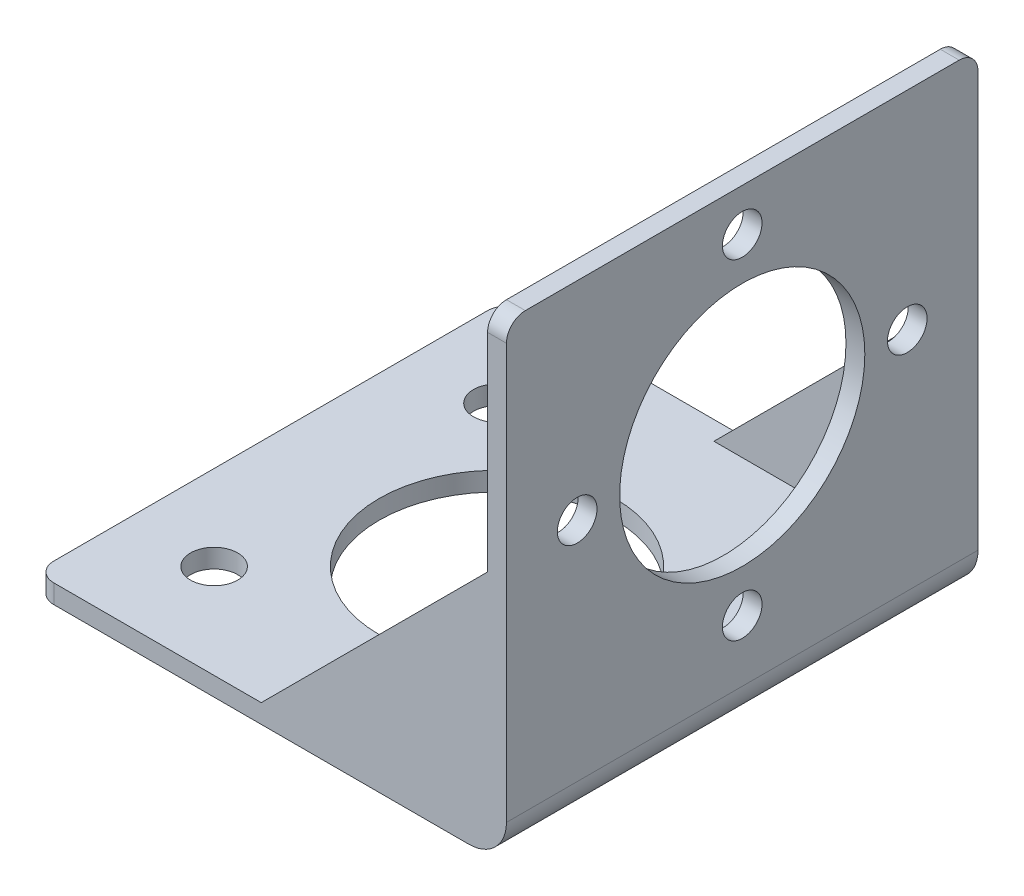
ISO-10303-21;
HEADER;
FILE_DESCRIPTION(('STEP AP214'),'2;1');
FILE_NAME('part.step','',(''),(''),'','','');
FILE_SCHEMA(('AUTOMOTIVE_DESIGN { 1 0 10303 214 1 1 1 1 }'));
ENDSEC;
DATA;
#1=APPLICATION_CONTEXT('core data for automotive mechanical design processes');
#2=APPLICATION_PROTOCOL_DEFINITION('international standard','automotive_design',2000,#1);
#3=PRODUCT_CONTEXT('',#1,'mechanical');
#4=PRODUCT('Part','Part','',(#3));
#5=PRODUCT_RELATED_PRODUCT_CATEGORY('part','',(#4));
#6=PRODUCT_DEFINITION_FORMATION('','',#4);
#7=PRODUCT_DEFINITION_CONTEXT('part definition',#1,'design');
#8=PRODUCT_DEFINITION('design','',#6,#7);
#9=PRODUCT_DEFINITION_SHAPE('','',#8);
#10=(LENGTH_UNIT() NAMED_UNIT(*) SI_UNIT(.MILLI.,.METRE.));
#11=(NAMED_UNIT(*) PLANE_ANGLE_UNIT() SI_UNIT($,.RADIAN.));
#12=(NAMED_UNIT(*) SI_UNIT($,.STERADIAN.) SOLID_ANGLE_UNIT());
#13=UNCERTAINTY_MEASURE_WITH_UNIT(LENGTH_MEASURE(1.E-05),#10,'distance_accuracy_value','');
#14=(GEOMETRIC_REPRESENTATION_CONTEXT(3) GLOBAL_UNCERTAINTY_ASSIGNED_CONTEXT((#13)) GLOBAL_UNIT_ASSIGNED_CONTEXT((#10,
#11,#12)) REPRESENTATION_CONTEXT('',''));
#15=CARTESIAN_POINT('',(0.,0.,0.));
#16=DIRECTION('',(0.,0.,1.));
#17=DIRECTION('',(1.,0.,0.));
#18=AXIS2_PLACEMENT_3D('',#15,#16,#17);
#19=CARTESIAN_POINT('',(46.,4.,50.));
#20=DIRECTION('',(0.,0.,-1.));
#21=DIRECTION('',(-1.,0.,0.));
#22=AXIS2_PLACEMENT_3D('',#19,#20,#21);
#23=CYLINDRICAL_SURFACE('',#22,2.);
#24=DIRECTION('',(0.,0.,-1.));
#25=VECTOR('',#24,1.);
#26=CARTESIAN_POINT('',(46.,2.,50.));
#27=LINE('',#26,#25);
#28=CARTESIAN_POINT('',(46.,2.,48.));
#29=VERTEX_POINT('',#28);
#30=CARTESIAN_POINT('',(46.,2.,2.));
#31=VERTEX_POINT('',#30);
#32=EDGE_CURVE('E244',#29,#31,#27,.T.);
#33=ORIENTED_EDGE('',*,*,#32,.F.);
#34=CARTESIAN_POINT('',(46.,4.,48.));
#35=DIRECTION('',(0.,0.,-1.));
#36=DIRECTION('',(-1.,0.,0.));
#37=AXIS2_PLACEMENT_3D('',#34,#35,#36);
#38=CIRCLE('',#37,2.);
#39=CARTESIAN_POINT('',(48.,4.,48.));
#40=VERTEX_POINT('',#39);
#41=EDGE_CURVE('E167',#29,#40,#38,.F.);
#42=ORIENTED_EDGE('',*,*,#41,.T.);
#43=DIRECTION('',(0.,0.,-1.));
#44=VECTOR('',#43,1.);
#45=CARTESIAN_POINT('',(48.,4.,50.));
#46=LINE('',#45,#44);
#47=CARTESIAN_POINT('',(48.,4.,2.));
#48=VERTEX_POINT('',#47);
#49=EDGE_CURVE('E165',#40,#48,#46,.T.);
#50=ORIENTED_EDGE('',*,*,#49,.T.);
#51=CARTESIAN_POINT('',(46.,4.,2.));
#52=DIRECTION('',(0.,0.,-1.));
#53=DIRECTION('',(-1.,0.,0.));
#54=AXIS2_PLACEMENT_3D('',#51,#52,#53);
#55=CIRCLE('',#54,2.);
#56=EDGE_CURVE('E178',#31,#48,#55,.F.);
#57=ORIENTED_EDGE('',*,*,#56,.F.);
#58=EDGE_LOOP('',(#33,#42,#50,#57));
#59=FACE_BOUND('',#58,.T.);
#60=ADVANCED_FACE('F35',(#59),#23,.F.);
#61=CARTESIAN_POINT('',(0.,1.99999999999999,50.));
#62=DIRECTION('',(1.,0.,0.));
#63=DIRECTION('',(0.,0.,-1.));
#64=AXIS2_PLACEMENT_3D('',#61,#62,#63);
#65=PLANE('',#64);
#66=DIRECTION('',(0.,0.,-1.));
#67=VECTOR('',#66,1.);
#68=CARTESIAN_POINT('',(0.,0.,50.));
#69=LINE('',#68,#67);
#70=CARTESIAN_POINT('',(0.,0.,48.));
#71=VERTEX_POINT('',#70);
#72=CARTESIAN_POINT('',(0.,0.,2.));
#73=VERTEX_POINT('',#72);
#74=EDGE_CURVE('E259',#71,#73,#69,.T.);
#75=ORIENTED_EDGE('',*,*,#74,.F.);
#76=DIRECTION('',(0.,-1.,0.));
#77=VECTOR('',#76,1.);
#78=CARTESIAN_POINT('',(0.,1.99999999999999,48.));
#79=LINE('',#78,#77);
#80=CARTESIAN_POINT('',(0.,1.99999999999999,48.));
#81=VERTEX_POINT('',#80);
#82=EDGE_CURVE('E288',#71,#81,#79,.F.);
#83=ORIENTED_EDGE('',*,*,#82,.T.);
#84=DIRECTION('',(0.,0.,-1.));
#85=VECTOR('',#84,1.);
#86=CARTESIAN_POINT('',(0.,1.99999999999999,50.));
#87=LINE('',#86,#85);
#88=CARTESIAN_POINT('',(0.,1.99999999999999,2.));
#89=VERTEX_POINT('',#88);
#90=EDGE_CURVE('E230',#81,#89,#87,.T.);
#91=ORIENTED_EDGE('',*,*,#90,.T.);
#92=DIRECTION('',(0.,-1.,0.));
#93=VECTOR('',#92,1.);
#94=CARTESIAN_POINT('',(0.,1.99999999999999,2.));
#95=LINE('',#94,#93);
#96=EDGE_CURVE('E285',#89,#73,#95,.T.);
#97=ORIENTED_EDGE('',*,*,#96,.T.);
#98=EDGE_LOOP('',(#75,#83,#91,#97));
#99=FACE_BOUND('',#98,.T.);
#100=ADVANCED_FACE('F351',(#99),#65,.F.);
#101=CARTESIAN_POINT('',(0.,0.,50.));
#102=DIRECTION('',(0.,1.,0.));
#103=DIRECTION('',(-1.,0.,0.));
#104=AXIS2_PLACEMENT_3D('',#101,#102,#103);
#105=PLANE('',#104);
#106=CARTESIAN_POINT('',(39.,0.,40.));
#107=DIRECTION('',(0.,-1.,0.));
#108=DIRECTION('',(1.,0.,0.));
#109=AXIS2_PLACEMENT_3D('',#106,#107,#108);
#110=CIRCLE('',#109,2.5);
#111=CARTESIAN_POINT('',(41.5,0.,40.));
#112=VERTEX_POINT('',#111);
#113=EDGE_CURVE('E185',#112,#112,#110,.T.);
#114=ORIENTED_EDGE('',*,*,#113,.F.);
#115=EDGE_LOOP('',(#114));
#116=FACE_BOUND('',#115,.T.);
#117=CARTESIAN_POINT('',(9.,0.,40.));
#118=DIRECTION('',(0.,-1.,0.));
#119=DIRECTION('',(1.,0.,0.));
#120=AXIS2_PLACEMENT_3D('',#117,#118,#119);
#121=CIRCLE('',#120,2.5);
#122=CARTESIAN_POINT('',(11.5,0.,40.));
#123=VERTEX_POINT('',#122);
#124=EDGE_CURVE('E193',#123,#123,#121,.T.);
#125=ORIENTED_EDGE('',*,*,#124,.F.);
#126=EDGE_LOOP('',(#125));
#127=FACE_BOUND('',#126,.T.);
#128=CARTESIAN_POINT('',(9.00000000000001,0.,10.));
#129=DIRECTION('',(0.,-1.,0.));
#130=DIRECTION('',(1.,0.,0.));
#131=AXIS2_PLACEMENT_3D('',#128,#129,#130);
#132=CIRCLE('',#131,2.5);
#133=CARTESIAN_POINT('',(11.5,0.,10.));
#134=VERTEX_POINT('',#133);
#135=EDGE_CURVE('E190',#134,#134,#132,.T.);
#136=ORIENTED_EDGE('',*,*,#135,.F.);
#137=EDGE_LOOP('',(#136));
#138=FACE_BOUND('',#137,.T.);
#139=CARTESIAN_POINT('',(39.,0.,10.));
#140=DIRECTION('',(0.,-1.,0.));
#141=DIRECTION('',(1.,0.,0.));
#142=AXIS2_PLACEMENT_3D('',#139,#140,#141);
#143=CIRCLE('',#142,2.5);
#144=CARTESIAN_POINT('',(41.5,0.,10.));
#145=VERTEX_POINT('',#144);
#146=EDGE_CURVE('E186',#145,#145,#143,.T.);
#147=ORIENTED_EDGE('',*,*,#146,.F.);
#148=EDGE_LOOP('',(#147));
#149=FACE_BOUND('',#148,.T.);
#150=CARTESIAN_POINT('',(24.,0.,25.));
#151=DIRECTION('',(0.,-1.,0.));
#152=DIRECTION('',(1.,0.,0.));
#153=AXIS2_PLACEMENT_3D('',#150,#151,#152);
#154=CIRCLE('',#153,12.5);
#155=CARTESIAN_POINT('',(36.5,0.,25.));
#156=VERTEX_POINT('',#155);
#157=EDGE_CURVE('E189',#156,#156,#154,.T.);
#158=ORIENTED_EDGE('',*,*,#157,.F.);
#159=EDGE_LOOP('',(#158));
#160=FACE_BOUND('',#159,.T.);
#161=DIRECTION('',(1.,0.,0.));
#162=VECTOR('',#161,1.);
#163=CARTESIAN_POINT('',(0.,0.,50.));
#164=LINE('',#163,#162);
#165=CARTESIAN_POINT('',(2.,0.,50.));
#166=VERTEX_POINT('',#165);
#167=CARTESIAN_POINT('',(46.,0.,50.));
#168=VERTEX_POINT('',#167);
#169=EDGE_CURVE('E218',#166,#168,#164,.T.);
#170=ORIENTED_EDGE('',*,*,#169,.F.);
#171=CARTESIAN_POINT('',(2.,0.,48.));
#172=DIRECTION('',(0.,1.,0.));
#173=DIRECTION('',(-1.,0.,0.));
#174=AXIS2_PLACEMENT_3D('',#171,#172,#173);
#175=CIRCLE('',#174,2.);
#176=EDGE_CURVE('E283',#166,#71,#175,.F.);
#177=ORIENTED_EDGE('',*,*,#176,.T.);
#178=ORIENTED_EDGE('',*,*,#74,.T.);
#179=CARTESIAN_POINT('',(2.,0.,2.));
#180=DIRECTION('',(0.,1.,0.));
#181=DIRECTION('',(-1.,0.,0.));
#182=AXIS2_PLACEMENT_3D('',#179,#180,#181);
#183=CIRCLE('',#182,2.);
#184=CARTESIAN_POINT('',(2.,0.,0.));
#185=VERTEX_POINT('',#184);
#186=EDGE_CURVE('E281',#73,#185,#183,.F.);
#187=ORIENTED_EDGE('',*,*,#186,.T.);
#188=DIRECTION('',(1.,0.,0.));
#189=VECTOR('',#188,1.);
#190=CARTESIAN_POINT('',(0.,0.,0.));
#191=LINE('',#190,#189);
#192=CARTESIAN_POINT('',(46.,0.,0.));
#193=VERTEX_POINT('',#192);
#194=EDGE_CURVE('E231',#185,#193,#191,.T.);
#195=ORIENTED_EDGE('',*,*,#194,.T.);
#196=DIRECTION('',(0.,0.,-1.));
#197=VECTOR('',#196,1.);
#198=CARTESIAN_POINT('',(46.,0.,50.));
#199=LINE('',#198,#197);
#200=EDGE_CURVE('E256',#168,#193,#199,.T.);
#201=ORIENTED_EDGE('',*,*,#200,.F.);
#202=EDGE_LOOP('',(#170,#177,#178,#187,#195,#201));
#203=FACE_BOUND('',#202,.T.);
#204=ADVANCED_FACE('F356',(#116,#127,#138,#149,#160,#203),#105,.F.);
#205=CARTESIAN_POINT('',(46.,4.,50.));
#206=DIRECTION('',(0.,0.,-1.));
#207=DIRECTION('',(-1.,0.,0.));
#208=AXIS2_PLACEMENT_3D('',#205,#206,#207);
#209=CYLINDRICAL_SURFACE('',#208,4.);
#210=DIRECTION('',(0.,0.,-1.));
#211=VECTOR('',#210,1.);
#212=CARTESIAN_POINT('',(50.,4.,50.));
#213=LINE('',#212,#211);
#214=CARTESIAN_POINT('',(50.,4.,50.));
#215=VERTEX_POINT('',#214);
#216=CARTESIAN_POINT('',(50.,4.,0.));
#217=VERTEX_POINT('',#216);
#218=EDGE_CURVE('E253',#215,#217,#213,.T.);
#219=ORIENTED_EDGE('',*,*,#218,.F.);
#220=CARTESIAN_POINT('',(46.,4.,50.));
#221=DIRECTION('',(0.,0.,1.));
#222=DIRECTION('',(1.,0.,0.));
#223=AXIS2_PLACEMENT_3D('',#220,#221,#222);
#224=CIRCLE('',#223,4.);
#225=EDGE_CURVE('E220',#168,#215,#224,.T.);
#226=ORIENTED_EDGE('',*,*,#225,.F.);
#227=ORIENTED_EDGE('',*,*,#200,.T.);
#228=CARTESIAN_POINT('',(46.,4.,0.));
#229=DIRECTION('',(0.,0.,1.));
#230=DIRECTION('',(1.,0.,0.));
#231=AXIS2_PLACEMENT_3D('',#228,#229,#230);
#232=CIRCLE('',#231,4.);
#233=EDGE_CURVE('E233',#193,#217,#232,.T.);
#234=ORIENTED_EDGE('',*,*,#233,.T.);
#235=EDGE_LOOP('',(#219,#226,#227,#234));
#236=FACE_BOUND('',#235,.T.);
#237=ADVANCED_FACE('F362',(#236),#209,.T.);
#238=CARTESIAN_POINT('',(50.,4.,50.));
#239=DIRECTION('',(-1.,0.,0.));
#240=DIRECTION('',(0.,0.,1.));
#241=AXIS2_PLACEMENT_3D('',#238,#239,#240);
#242=PLANE('',#241);
#243=CARTESIAN_POINT('',(50.,45.5,25.));
#244=DIRECTION('',(1.,0.,0.));
#245=DIRECTION('',(0.,0.,-1.));
#246=AXIS2_PLACEMENT_3D('',#243,#244,#245);
#247=CIRCLE('',#246,2.1);
#248=CARTESIAN_POINT('',(50.,45.5,22.9));
#249=VERTEX_POINT('',#248);
#250=EDGE_CURVE('E209',#249,#249,#247,.T.);
#251=ORIENTED_EDGE('',*,*,#250,.F.);
#252=EDGE_LOOP('',(#251));
#253=FACE_BOUND('',#252,.T.);
#254=CARTESIAN_POINT('',(50.,28.,7.5));
#255=DIRECTION('',(1.,0.,0.));
#256=DIRECTION('',(0.,0.,-1.));
#257=AXIS2_PLACEMENT_3D('',#254,#255,#256);
#258=CIRCLE('',#257,2.1);
#259=CARTESIAN_POINT('',(50.,28.,5.4));
#260=VERTEX_POINT('',#259);
#261=EDGE_CURVE('E204',#260,#260,#258,.T.);
#262=ORIENTED_EDGE('',*,*,#261,.F.);
#263=EDGE_LOOP('',(#262));
#264=FACE_BOUND('',#263,.T.);
#265=CARTESIAN_POINT('',(50.,10.5,25.));
#266=DIRECTION('',(1.,0.,0.));
#267=DIRECTION('',(0.,0.,-1.));
#268=AXIS2_PLACEMENT_3D('',#265,#266,#267);
#269=CIRCLE('',#268,2.1);
#270=CARTESIAN_POINT('',(50.,10.5,22.9));
#271=VERTEX_POINT('',#270);
#272=EDGE_CURVE('E201',#271,#271,#269,.T.);
#273=ORIENTED_EDGE('',*,*,#272,.F.);
#274=EDGE_LOOP('',(#273));
#275=FACE_BOUND('',#274,.T.);
#276=CARTESIAN_POINT('',(50.,28.,42.5));
#277=DIRECTION('',(1.,0.,0.));
#278=DIRECTION('',(0.,0.,-1.));
#279=AXIS2_PLACEMENT_3D('',#276,#277,#278);
#280=CIRCLE('',#279,2.1);
#281=CARTESIAN_POINT('',(50.,28.,40.4));
#282=VERTEX_POINT('',#281);
#283=EDGE_CURVE('E205',#282,#282,#280,.T.);
#284=ORIENTED_EDGE('',*,*,#283,.F.);
#285=EDGE_LOOP('',(#284));
#286=FACE_BOUND('',#285,.T.);
#287=CARTESIAN_POINT('',(50.,28.,25.));
#288=DIRECTION('',(1.,0.,0.));
#289=DIRECTION('',(0.,0.,-1.));
#290=AXIS2_PLACEMENT_3D('',#287,#288,#289);
#291=CIRCLE('',#290,13.);
#292=CARTESIAN_POINT('',(50.,28.,12.));
#293=VERTEX_POINT('',#292);
#294=EDGE_CURVE('E212',#293,#293,#291,.T.);
#295=ORIENTED_EDGE('',*,*,#294,.F.);
#296=EDGE_LOOP('',(#295));
#297=FACE_BOUND('',#296,.T.);
#298=DIRECTION('',(0.,1.,0.));
#299=VECTOR('',#298,1.);
#300=CARTESIAN_POINT('',(50.,4.,0.));
#301=LINE('',#300,#299);
#302=CARTESIAN_POINT('',(50.,48.,0.));
#303=VERTEX_POINT('',#302);
#304=EDGE_CURVE('E236',#217,#303,#301,.T.);
#305=ORIENTED_EDGE('',*,*,#304,.T.);
#306=CARTESIAN_POINT('',(50.,48.,2.));
#307=DIRECTION('',(-1.,0.,0.));
#308=DIRECTION('',(0.,0.,1.));
#309=AXIS2_PLACEMENT_3D('',#306,#307,#308);
#310=CIRCLE('',#309,2.);
#311=CARTESIAN_POINT('',(50.,50.,2.));
#312=VERTEX_POINT('',#311);
#313=EDGE_CURVE('E311',#303,#312,#310,.F.);
#314=ORIENTED_EDGE('',*,*,#313,.T.);
#315=DIRECTION('',(0.,0.,-1.));
#316=VECTOR('',#315,1.);
#317=CARTESIAN_POINT('',(50.,50.,50.));
#318=LINE('',#317,#316);
#319=CARTESIAN_POINT('',(50.,50.,48.));
#320=VERTEX_POINT('',#319);
#321=EDGE_CURVE('E250',#320,#312,#318,.T.);
#322=ORIENTED_EDGE('',*,*,#321,.F.);
#323=CARTESIAN_POINT('',(50.,48.,48.));
#324=DIRECTION('',(-1.,0.,0.));
#325=DIRECTION('',(0.,0.,1.));
#326=AXIS2_PLACEMENT_3D('',#323,#324,#325);
#327=CIRCLE('',#326,2.);
#328=CARTESIAN_POINT('',(50.,48.,50.));
#329=VERTEX_POINT('',#328);
#330=EDGE_CURVE('E309',#320,#329,#327,.F.);
#331=ORIENTED_EDGE('',*,*,#330,.T.);
#332=DIRECTION('',(0.,1.,0.));
#333=VECTOR('',#332,1.);
#334=CARTESIAN_POINT('',(50.,4.,50.));
#335=LINE('',#334,#333);
#336=EDGE_CURVE('E223',#215,#329,#335,.T.);
#337=ORIENTED_EDGE('',*,*,#336,.F.);
#338=ORIENTED_EDGE('',*,*,#218,.T.);
#339=EDGE_LOOP('',(#305,#314,#322,#331,#337,#338));
#340=FACE_BOUND('',#339,.T.);
#341=ADVANCED_FACE('F366',(#253,#264,#275,#286,#297,#340),#242,.F.);
#342=CARTESIAN_POINT('',(50.,50.,50.));
#343=DIRECTION('',(0.,-1.,0.));
#344=DIRECTION('',(0.,0.,-1.));
#345=AXIS2_PLACEMENT_3D('',#342,#343,#344);
#346=PLANE('',#345);
#347=ORIENTED_EDGE('',*,*,#321,.T.);
#348=DIRECTION('',(-1.,0.,0.));
#349=VECTOR('',#348,1.);
#350=CARTESIAN_POINT('',(50.,50.,2.));
#351=LINE('',#350,#349);
#352=CARTESIAN_POINT('',(48.,50.,2.));
#353=VERTEX_POINT('',#352);
#354=EDGE_CURVE('E302',#312,#353,#351,.T.);
#355=ORIENTED_EDGE('',*,*,#354,.T.);
#356=DIRECTION('',(0.,0.,-1.));
#357=VECTOR('',#356,1.);
#358=CARTESIAN_POINT('',(48.,50.,50.));
#359=LINE('',#358,#357);
#360=CARTESIAN_POINT('',(48.,50.,48.));
#361=VERTEX_POINT('',#360);
#362=EDGE_CURVE('E247',#361,#353,#359,.T.);
#363=ORIENTED_EDGE('',*,*,#362,.F.);
#364=DIRECTION('',(-1.,0.,0.));
#365=VECTOR('',#364,1.);
#366=CARTESIAN_POINT('',(50.,50.,48.));
#367=LINE('',#366,#365);
#368=EDGE_CURVE('E300',#361,#320,#367,.F.);
#369=ORIENTED_EDGE('',*,*,#368,.T.);
#370=EDGE_LOOP('',(#347,#355,#363,#369));
#371=FACE_BOUND('',#370,.T.);
#372=ADVANCED_FACE('F376',(#371),#346,.F.);
#373=CARTESIAN_POINT('',(48.,50.,50.));
#374=DIRECTION('',(1.,0.,0.));
#375=DIRECTION('',(0.,1.,0.));
#376=AXIS2_PLACEMENT_3D('',#373,#374,#375);
#377=PLANE('',#376);
#378=CARTESIAN_POINT('',(48.,45.5,25.));
#379=DIRECTION('',(1.,0.,0.));
#380=DIRECTION('',(0.,1.,0.));
#381=AXIS2_PLACEMENT_3D('',#378,#379,#380);
#382=CIRCLE('',#381,2.1);
#383=CARTESIAN_POINT('',(48.,47.6,25.));
#384=VERTEX_POINT('',#383);
#385=EDGE_CURVE('E234',#384,#384,#382,.T.);
#386=ORIENTED_EDGE('',*,*,#385,.T.);
#387=EDGE_LOOP('',(#386));
#388=FACE_BOUND('',#387,.T.);
#389=CARTESIAN_POINT('',(48.,28.,7.5));
#390=DIRECTION('',(1.,0.,0.));
#391=DIRECTION('',(0.,1.,0.));
#392=AXIS2_PLACEMENT_3D('',#389,#390,#391);
#393=CIRCLE('',#392,2.1);
#394=CARTESIAN_POINT('',(48.,30.1,7.5));
#395=VERTEX_POINT('',#394);
#396=EDGE_CURVE('E271',#395,#395,#393,.T.);
#397=ORIENTED_EDGE('',*,*,#396,.T.);
#398=EDGE_LOOP('',(#397));
#399=FACE_BOUND('',#398,.T.);
#400=CARTESIAN_POINT('',(48.,10.5,25.));
#401=DIRECTION('',(1.,0.,0.));
#402=DIRECTION('',(0.,1.,0.));
#403=AXIS2_PLACEMENT_3D('',#400,#401,#402);
#404=CIRCLE('',#403,2.1);
#405=CARTESIAN_POINT('',(48.,12.6,25.));
#406=VERTEX_POINT('',#405);
#407=EDGE_CURVE('E268',#406,#406,#404,.T.);
#408=ORIENTED_EDGE('',*,*,#407,.T.);
#409=EDGE_LOOP('',(#408));
#410=FACE_BOUND('',#409,.T.);
#411=CARTESIAN_POINT('',(48.,28.,42.5));
#412=DIRECTION('',(1.,0.,0.));
#413=DIRECTION('',(0.,1.,0.));
#414=AXIS2_PLACEMENT_3D('',#411,#412,#413);
#415=CIRCLE('',#414,2.1);
#416=CARTESIAN_POINT('',(48.,30.1,42.5));
#417=VERTEX_POINT('',#416);
#418=EDGE_CURVE('E265',#417,#417,#415,.T.);
#419=ORIENTED_EDGE('',*,*,#418,.T.);
#420=EDGE_LOOP('',(#419));
#421=FACE_BOUND('',#420,.T.);
#422=CARTESIAN_POINT('',(48.,28.,25.));
#423=DIRECTION('',(1.,0.,0.));
#424=DIRECTION('',(0.,1.,0.));
#425=AXIS2_PLACEMENT_3D('',#422,#423,#424);
#426=CIRCLE('',#425,13.);
#427=CARTESIAN_POINT('',(48.,41.,25.));
#428=VERTEX_POINT('',#427);
#429=EDGE_CURVE('E217',#428,#428,#426,.T.);
#430=ORIENTED_EDGE('',*,*,#429,.T.);
#431=EDGE_LOOP('',(#430));
#432=FACE_BOUND('',#431,.T.);
#433=DIRECTION('',(0.,1.,0.));
#434=VECTOR('',#433,1.);
#435=CARTESIAN_POINT('',(48.,50.,48.));
#436=LINE('',#435,#434);
#437=CARTESIAN_POINT('',(48.,26.,48.));
#438=VERTEX_POINT('',#437);
#439=EDGE_CURVE('E160',#40,#438,#436,.T.);
#440=ORIENTED_EDGE('',*,*,#439,.T.);
#441=DIRECTION('',(0.,0.,1.));
#442=VECTOR('',#441,1.);
#443=CARTESIAN_POINT('',(48.,26.,48.));
#444=LINE('',#443,#442);
#445=CARTESIAN_POINT('',(48.,26.,50.));
#446=VERTEX_POINT('',#445);
#447=EDGE_CURVE('E149',#438,#446,#444,.T.);
#448=ORIENTED_EDGE('',*,*,#447,.T.);
#449=DIRECTION('',(0.,-1.,0.));
#450=VECTOR('',#449,1.);
#451=CARTESIAN_POINT('',(48.,50.,50.));
#452=LINE('',#451,#450);
#453=CARTESIAN_POINT('',(48.,48.,50.));
#454=VERTEX_POINT('',#453);
#455=EDGE_CURVE('E226',#454,#446,#452,.T.);
#456=ORIENTED_EDGE('',*,*,#455,.F.);
#457=CARTESIAN_POINT('',(48.,48.,48.));
#458=DIRECTION('',(1.,0.,0.));
#459=DIRECTION('',(0.,1.,0.));
#460=AXIS2_PLACEMENT_3D('',#457,#458,#459);
#461=CIRCLE('',#460,2.);
#462=EDGE_CURVE('E305',#454,#361,#461,.F.);
#463=ORIENTED_EDGE('',*,*,#462,.T.);
#464=ORIENTED_EDGE('',*,*,#362,.T.);
#465=CARTESIAN_POINT('',(48.,48.,2.));
#466=DIRECTION('',(1.,0.,0.));
#467=DIRECTION('',(0.,1.,0.));
#468=AXIS2_PLACEMENT_3D('',#465,#466,#467);
#469=CIRCLE('',#468,2.);
#470=CARTESIAN_POINT('',(48.,48.,0.));
#471=VERTEX_POINT('',#470);
#472=EDGE_CURVE('E307',#353,#471,#469,.F.);
#473=ORIENTED_EDGE('',*,*,#472,.T.);
#474=DIRECTION('',(0.,-1.,0.));
#475=VECTOR('',#474,1.);
#476=CARTESIAN_POINT('',(48.,50.,0.));
#477=LINE('',#476,#475);
#478=CARTESIAN_POINT('',(48.,26.,0.));
#479=VERTEX_POINT('',#478);
#480=EDGE_CURVE('E239',#471,#479,#477,.T.);
#481=ORIENTED_EDGE('',*,*,#480,.T.);
#482=DIRECTION('',(0.,0.,-1.));
#483=VECTOR('',#482,1.);
#484=CARTESIAN_POINT('',(48.,26.,2.));
#485=LINE('',#484,#483);
#486=CARTESIAN_POINT('',(48.,26.,2.));
#487=VERTEX_POINT('',#486);
#488=EDGE_CURVE('E58',#487,#479,#485,.T.);
#489=ORIENTED_EDGE('',*,*,#488,.F.);
#490=DIRECTION('',(0.,1.,0.));
#491=VECTOR('',#490,1.);
#492=CARTESIAN_POINT('',(48.,50.,2.));
#493=LINE('',#492,#491);
#494=EDGE_CURVE('E183',#48,#487,#493,.T.);
#495=ORIENTED_EDGE('',*,*,#494,.F.);
#496=ORIENTED_EDGE('',*,*,#49,.F.);
#497=EDGE_LOOP('',(#440,#448,#456,#463,#464,#473,#481,#489,#495,#496));
#498=FACE_BOUND('',#497,.T.);
#499=ADVANCED_FACE('F164',(#388,#399,#410,#421,#432,#498),#377,.F.);
#500=CARTESIAN_POINT('',(46.,2.,50.));
#501=DIRECTION('',(0.,-1.,0.));
#502=DIRECTION('',(1.,0.,0.));
#503=AXIS2_PLACEMENT_3D('',#500,#501,#502);
#504=PLANE('',#503);
#505=CARTESIAN_POINT('',(39.,2.,40.));
#506=DIRECTION('',(0.,-1.,0.));
#507=DIRECTION('',(1.,0.,0.));
#508=AXIS2_PLACEMENT_3D('',#505,#506,#507);
#509=CIRCLE('',#508,2.5);
#510=CARTESIAN_POINT('',(41.5,2.,40.));
#511=VERTEX_POINT('',#510);
#512=EDGE_CURVE('E208',#511,#511,#509,.T.);
#513=ORIENTED_EDGE('',*,*,#512,.T.);
#514=EDGE_LOOP('',(#513));
#515=FACE_BOUND('',#514,.T.);
#516=CARTESIAN_POINT('',(9.,1.99999999999999,40.));
#517=DIRECTION('',(0.,-1.,0.));
#518=DIRECTION('',(1.,0.,0.));
#519=AXIS2_PLACEMENT_3D('',#516,#517,#518);
#520=CIRCLE('',#519,2.5);
#521=CARTESIAN_POINT('',(11.5,2.,40.));
#522=VERTEX_POINT('',#521);
#523=EDGE_CURVE('E321',#522,#522,#520,.T.);
#524=ORIENTED_EDGE('',*,*,#523,.T.);
#525=EDGE_LOOP('',(#524));
#526=FACE_BOUND('',#525,.T.);
#527=CARTESIAN_POINT('',(9.00000000000001,1.99999999999999,10.));
#528=DIRECTION('',(0.,-1.,0.));
#529=DIRECTION('',(1.,0.,0.));
#530=AXIS2_PLACEMENT_3D('',#527,#528,#529);
#531=CIRCLE('',#530,2.5);
#532=CARTESIAN_POINT('',(11.5,2.,10.));
#533=VERTEX_POINT('',#532);
#534=EDGE_CURVE('E318',#533,#533,#531,.T.);
#535=ORIENTED_EDGE('',*,*,#534,.T.);
#536=EDGE_LOOP('',(#535));
#537=FACE_BOUND('',#536,.T.);
#538=CARTESIAN_POINT('',(39.,2.,10.));
#539=DIRECTION('',(0.,-1.,0.));
#540=DIRECTION('',(1.,0.,0.));
#541=AXIS2_PLACEMENT_3D('',#538,#539,#540);
#542=CIRCLE('',#541,2.5);
#543=CARTESIAN_POINT('',(41.5,2.,10.));
#544=VERTEX_POINT('',#543);
#545=EDGE_CURVE('E315',#544,#544,#542,.T.);
#546=ORIENTED_EDGE('',*,*,#545,.T.);
#547=EDGE_LOOP('',(#546));
#548=FACE_BOUND('',#547,.T.);
#549=CARTESIAN_POINT('',(24.,1.99999999999999,25.));
#550=DIRECTION('',(0.,-1.,0.));
#551=DIRECTION('',(1.,0.,0.));
#552=AXIS2_PLACEMENT_3D('',#549,#550,#551);
#553=CIRCLE('',#552,12.5);
#554=CARTESIAN_POINT('',(36.5,2.,25.));
#555=VERTEX_POINT('',#554);
#556=EDGE_CURVE('E200',#555,#555,#553,.T.);
#557=ORIENTED_EDGE('',*,*,#556,.T.);
#558=EDGE_LOOP('',(#557));
#559=FACE_BOUND('',#558,.T.);
#560=DIRECTION('',(-1.,0.,0.));
#561=VECTOR('',#560,1.);
#562=CARTESIAN_POINT('',(46.,2.,50.));
#563=LINE('',#562,#561);
#564=CARTESIAN_POINT('',(24.,1.99999999999999,50.));
#565=VERTEX_POINT('',#564);
#566=CARTESIAN_POINT('',(2.,1.99999999999999,50.));
#567=VERTEX_POINT('',#566);
#568=EDGE_CURVE('E228',#565,#567,#563,.T.);
#569=ORIENTED_EDGE('',*,*,#568,.F.);
#570=DIRECTION('',(0.,0.,1.));
#571=VECTOR('',#570,1.);
#572=CARTESIAN_POINT('',(24.,2.,48.));
#573=LINE('',#572,#571);
#574=CARTESIAN_POINT('',(24.,2.,48.));
#575=VERTEX_POINT('',#574);
#576=EDGE_CURVE('E156',#575,#565,#573,.T.);
#577=ORIENTED_EDGE('',*,*,#576,.F.);
#578=DIRECTION('',(1.,0.,0.));
#579=VECTOR('',#578,1.);
#580=CARTESIAN_POINT('',(46.,2.,48.));
#581=LINE('',#580,#579);
#582=EDGE_CURVE('E11',#575,#29,#581,.T.);
#583=ORIENTED_EDGE('',*,*,#582,.T.);
#584=ORIENTED_EDGE('',*,*,#32,.T.);
#585=DIRECTION('',(1.,0.,0.));
#586=VECTOR('',#585,1.);
#587=CARTESIAN_POINT('',(46.,2.,2.));
#588=LINE('',#587,#586);
#589=CARTESIAN_POINT('',(24.,1.99999999999999,2.));
#590=VERTEX_POINT('',#589);
#591=EDGE_CURVE('E43',#590,#31,#588,.T.);
#592=ORIENTED_EDGE('',*,*,#591,.F.);
#593=DIRECTION('',(0.,0.,-1.));
#594=VECTOR('',#593,1.);
#595=CARTESIAN_POINT('',(24.,2.,2.));
#596=LINE('',#595,#594);
#597=CARTESIAN_POINT('',(24.,2.,0.));
#598=VERTEX_POINT('',#597);
#599=EDGE_CURVE('E175',#590,#598,#596,.T.);
#600=ORIENTED_EDGE('',*,*,#599,.T.);
#601=DIRECTION('',(-1.,0.,0.));
#602=VECTOR('',#601,1.);
#603=CARTESIAN_POINT('',(46.,2.,0.));
#604=LINE('',#603,#602);
#605=CARTESIAN_POINT('',(2.,1.99999999999999,0.));
#606=VERTEX_POINT('',#605);
#607=EDGE_CURVE('E221',#598,#606,#604,.T.);
#608=ORIENTED_EDGE('',*,*,#607,.T.);
#609=CARTESIAN_POINT('',(2.,1.99999999999999,2.));
#610=DIRECTION('',(0.,-1.,0.));
#611=DIRECTION('',(1.,0.,0.));
#612=AXIS2_PLACEMENT_3D('',#609,#610,#611);
#613=CIRCLE('',#612,2.);
#614=EDGE_CURVE('E290',#606,#89,#613,.F.);
#615=ORIENTED_EDGE('',*,*,#614,.T.);
#616=ORIENTED_EDGE('',*,*,#90,.F.);
#617=CARTESIAN_POINT('',(2.,1.99999999999999,48.));
#618=DIRECTION('',(0.,-1.,0.));
#619=DIRECTION('',(1.,0.,0.));
#620=AXIS2_PLACEMENT_3D('',#617,#618,#619);
#621=CIRCLE('',#620,2.);
#622=EDGE_CURVE('E292',#81,#567,#621,.F.);
#623=ORIENTED_EDGE('',*,*,#622,.T.);
#624=EDGE_LOOP('',(#569,#577,#583,#584,#592,#600,#608,#615,#616,#623));
#625=FACE_BOUND('',#624,.T.);
#626=ADVANCED_FACE('F333',(#515,#526,#537,#548,#559,#625),#504,.F.);
#627=CARTESIAN_POINT('',(46.,4.,50.));
#628=DIRECTION('',(0.,0.,1.));
#629=DIRECTION('',(1.,0.,0.));
#630=AXIS2_PLACEMENT_3D('',#627,#628,#629);
#631=PLANE('',#630);
#632=ORIENTED_EDGE('',*,*,#225,.T.);
#633=ORIENTED_EDGE('',*,*,#336,.T.);
#634=DIRECTION('',(-1.,0.,0.));
#635=VECTOR('',#634,1.);
#636=CARTESIAN_POINT('',(48.,48.,50.));
#637=LINE('',#636,#635);
#638=EDGE_CURVE('E262',#329,#454,#637,.T.);
#639=ORIENTED_EDGE('',*,*,#638,.T.);
#640=ORIENTED_EDGE('',*,*,#455,.T.);
#641=DIRECTION('',(-0.707106781186548,-0.707106781186547,0.));
#642=VECTOR('',#641,1.);
#643=CARTESIAN_POINT('',(36.,14.,50.));
#644=LINE('',#643,#642);
#645=EDGE_CURVE('E50',#446,#565,#644,.T.);
#646=ORIENTED_EDGE('',*,*,#645,.T.);
#647=ORIENTED_EDGE('',*,*,#568,.T.);
#648=DIRECTION('',(0.,-1.,0.));
#649=VECTOR('',#648,1.);
#650=CARTESIAN_POINT('',(2.,0.,50.));
#651=LINE('',#650,#649);
#652=EDGE_CURVE('E278',#567,#166,#651,.T.);
#653=ORIENTED_EDGE('',*,*,#652,.T.);
#654=ORIENTED_EDGE('',*,*,#169,.T.);
#655=EDGE_LOOP('',(#632,#633,#639,#640,#646,#647,#653,#654));
#656=FACE_BOUND('',#655,.T.);
#657=ADVANCED_FACE('F371',(#656),#631,.T.);
#658=CARTESIAN_POINT('',(46.,4.,0.));
#659=DIRECTION('',(0.,0.,1.));
#660=DIRECTION('',(1.,0.,0.));
#661=AXIS2_PLACEMENT_3D('',#658,#659,#660);
#662=PLANE('',#661);
#663=ORIENTED_EDGE('',*,*,#607,.F.);
#664=DIRECTION('',(0.707106781186548,0.707106781186547,0.));
#665=VECTOR('',#664,1.);
#666=CARTESIAN_POINT('',(48.,26.,0.));
#667=LINE('',#666,#665);
#668=EDGE_CURVE('E166',#598,#479,#667,.T.);
#669=ORIENTED_EDGE('',*,*,#668,.T.);
#670=ORIENTED_EDGE('',*,*,#480,.F.);
#671=DIRECTION('',(-1.,0.,0.));
#672=VECTOR('',#671,1.);
#673=CARTESIAN_POINT('',(46.,48.,0.));
#674=LINE('',#673,#672);
#675=EDGE_CURVE('E295',#471,#303,#674,.F.);
#676=ORIENTED_EDGE('',*,*,#675,.T.);
#677=ORIENTED_EDGE('',*,*,#304,.F.);
#678=ORIENTED_EDGE('',*,*,#233,.F.);
#679=ORIENTED_EDGE('',*,*,#194,.F.);
#680=DIRECTION('',(0.,-1.,0.));
#681=VECTOR('',#680,1.);
#682=CARTESIAN_POINT('',(2.,4.,0.));
#683=LINE('',#682,#681);
#684=EDGE_CURVE('E297',#185,#606,#683,.F.);
#685=ORIENTED_EDGE('',*,*,#684,.T.);
#686=EDGE_LOOP('',(#663,#669,#670,#676,#677,#678,#679,#685));
#687=FACE_BOUND('',#686,.T.);
#688=ADVANCED_FACE('F340',(#687),#662,.F.);
#689=CARTESIAN_POINT('',(0.,28.,25.));
#690=DIRECTION('',(1.,0.,0.));
#691=DIRECTION('',(0.,0.,-1.));
#692=AXIS2_PLACEMENT_3D('',#689,#690,#691);
#693=CYLINDRICAL_SURFACE('',#692,13.);
#694=ORIENTED_EDGE('',*,*,#294,.T.);
#695=EDGE_LOOP('',(#694));
#696=FACE_BOUND('',#695,.T.);
#697=ORIENTED_EDGE('',*,*,#429,.F.);
#698=EDGE_LOOP('',(#697));
#699=FACE_BOUND('',#698,.T.);
#700=ADVANCED_FACE('F434',(#696,#699),#693,.F.);
#701=CARTESIAN_POINT('',(0.,28.,42.5));
#702=DIRECTION('',(1.,0.,0.));
#703=DIRECTION('',(0.,0.,-1.));
#704=AXIS2_PLACEMENT_3D('',#701,#702,#703);
#705=CYLINDRICAL_SURFACE('',#704,2.1);
#706=ORIENTED_EDGE('',*,*,#283,.T.);
#707=EDGE_LOOP('',(#706));
#708=FACE_BOUND('',#707,.T.);
#709=ORIENTED_EDGE('',*,*,#418,.F.);
#710=EDGE_LOOP('',(#709));
#711=FACE_BOUND('',#710,.T.);
#712=ADVANCED_FACE('F431',(#708,#711),#705,.F.);
#713=CARTESIAN_POINT('',(0.,10.5,25.));
#714=DIRECTION('',(1.,0.,0.));
#715=DIRECTION('',(0.,0.,-1.));
#716=AXIS2_PLACEMENT_3D('',#713,#714,#715);
#717=CYLINDRICAL_SURFACE('',#716,2.1);
#718=ORIENTED_EDGE('',*,*,#272,.T.);
#719=EDGE_LOOP('',(#718));
#720=FACE_BOUND('',#719,.T.);
#721=ORIENTED_EDGE('',*,*,#407,.F.);
#722=EDGE_LOOP('',(#721));
#723=FACE_BOUND('',#722,.T.);
#724=ADVANCED_FACE('F426',(#720,#723),#717,.F.);
#725=CARTESIAN_POINT('',(0.,28.,7.5));
#726=DIRECTION('',(1.,0.,0.));
#727=DIRECTION('',(0.,0.,-1.));
#728=AXIS2_PLACEMENT_3D('',#725,#726,#727);
#729=CYLINDRICAL_SURFACE('',#728,2.1);
#730=ORIENTED_EDGE('',*,*,#261,.T.);
#731=EDGE_LOOP('',(#730));
#732=FACE_BOUND('',#731,.T.);
#733=ORIENTED_EDGE('',*,*,#396,.F.);
#734=EDGE_LOOP('',(#733));
#735=FACE_BOUND('',#734,.T.);
#736=ADVANCED_FACE('F417',(#732,#735),#729,.F.);
#737=CARTESIAN_POINT('',(0.,45.5,25.));
#738=DIRECTION('',(1.,0.,0.));
#739=DIRECTION('',(0.,0.,-1.));
#740=AXIS2_PLACEMENT_3D('',#737,#738,#739);
#741=CYLINDRICAL_SURFACE('',#740,2.1);
#742=ORIENTED_EDGE('',*,*,#250,.T.);
#743=EDGE_LOOP('',(#742));
#744=FACE_BOUND('',#743,.T.);
#745=ORIENTED_EDGE('',*,*,#385,.F.);
#746=EDGE_LOOP('',(#745));
#747=FACE_BOUND('',#746,.T.);
#748=ADVANCED_FACE('F412',(#744,#747),#741,.F.);
#749=CARTESIAN_POINT('',(2.,4.,48.));
#750=DIRECTION('',(0.,1.,0.));
#751=DIRECTION('',(0.,0.,1.));
#752=AXIS2_PLACEMENT_3D('',#749,#750,#751);
#753=CYLINDRICAL_SURFACE('',#752,2.);
#754=ORIENTED_EDGE('',*,*,#622,.F.);
#755=ORIENTED_EDGE('',*,*,#82,.F.);
#756=ORIENTED_EDGE('',*,*,#176,.F.);
#757=ORIENTED_EDGE('',*,*,#652,.F.);
#758=EDGE_LOOP('',(#754,#755,#756,#757));
#759=FACE_BOUND('',#758,.T.);
#760=ADVANCED_FACE('F386',(#759),#753,.T.);
#761=CARTESIAN_POINT('',(2.,1.99999999999999,2.));
#762=DIRECTION('',(0.,-1.,0.));
#763=DIRECTION('',(0.,0.,-1.));
#764=AXIS2_PLACEMENT_3D('',#761,#762,#763);
#765=CYLINDRICAL_SURFACE('',#764,2.);
#766=ORIENTED_EDGE('',*,*,#614,.F.);
#767=ORIENTED_EDGE('',*,*,#684,.F.);
#768=ORIENTED_EDGE('',*,*,#186,.F.);
#769=ORIENTED_EDGE('',*,*,#96,.F.);
#770=EDGE_LOOP('',(#766,#767,#768,#769));
#771=FACE_BOUND('',#770,.T.);
#772=ADVANCED_FACE('F353',(#771),#765,.T.);
#773=CARTESIAN_POINT('',(50.,48.,2.));
#774=DIRECTION('',(-1.,0.,0.));
#775=DIRECTION('',(0.,0.,1.));
#776=AXIS2_PLACEMENT_3D('',#773,#774,#775);
#777=CYLINDRICAL_SURFACE('',#776,2.);
#778=ORIENTED_EDGE('',*,*,#313,.F.);
#779=ORIENTED_EDGE('',*,*,#675,.F.);
#780=ORIENTED_EDGE('',*,*,#472,.F.);
#781=ORIENTED_EDGE('',*,*,#354,.F.);
#782=EDGE_LOOP('',(#778,#779,#780,#781));
#783=FACE_BOUND('',#782,.T.);
#784=ADVANCED_FACE('F379',(#783),#777,.T.);
#785=CARTESIAN_POINT('',(46.,48.,48.));
#786=DIRECTION('',(1.,0.,0.));
#787=DIRECTION('',(0.,0.,-1.));
#788=AXIS2_PLACEMENT_3D('',#785,#786,#787);
#789=CYLINDRICAL_SURFACE('',#788,2.);
#790=ORIENTED_EDGE('',*,*,#330,.F.);
#791=ORIENTED_EDGE('',*,*,#368,.F.);
#792=ORIENTED_EDGE('',*,*,#462,.F.);
#793=ORIENTED_EDGE('',*,*,#638,.F.);
#794=EDGE_LOOP('',(#790,#791,#792,#793));
#795=FACE_BOUND('',#794,.T.);
#796=ADVANCED_FACE('F37',(#795),#789,.T.);
#797=CARTESIAN_POINT('',(24.,50.,25.));
#798=DIRECTION('',(0.,-1.,0.));
#799=DIRECTION('',(1.,0.,0.));
#800=AXIS2_PLACEMENT_3D('',#797,#798,#799);
#801=CYLINDRICAL_SURFACE('',#800,12.5);
#802=ORIENTED_EDGE('',*,*,#157,.T.);
#803=EDGE_LOOP('',(#802));
#804=FACE_BOUND('',#803,.T.);
#805=ORIENTED_EDGE('',*,*,#556,.F.);
#806=EDGE_LOOP('',(#805));
#807=FACE_BOUND('',#806,.T.);
#808=ADVANCED_FACE('F385',(#804,#807),#801,.F.);
#809=CARTESIAN_POINT('',(39.,50.,10.));
#810=DIRECTION('',(0.,-1.,0.));
#811=DIRECTION('',(1.,0.,0.));
#812=AXIS2_PLACEMENT_3D('',#809,#810,#811);
#813=CYLINDRICAL_SURFACE('',#812,2.5);
#814=ORIENTED_EDGE('',*,*,#146,.T.);
#815=EDGE_LOOP('',(#814));
#816=FACE_BOUND('',#815,.T.);
#817=ORIENTED_EDGE('',*,*,#545,.F.);
#818=EDGE_LOOP('',(#817));
#819=FACE_BOUND('',#818,.T.);
#820=ADVANCED_FACE('F526',(#816,#819),#813,.F.);
#821=CARTESIAN_POINT('',(9.00000000000001,50.,10.));
#822=DIRECTION('',(0.,-1.,0.));
#823=DIRECTION('',(1.,0.,0.));
#824=AXIS2_PLACEMENT_3D('',#821,#822,#823);
#825=CYLINDRICAL_SURFACE('',#824,2.5);
#826=ORIENTED_EDGE('',*,*,#135,.T.);
#827=EDGE_LOOP('',(#826));
#828=FACE_BOUND('',#827,.T.);
#829=ORIENTED_EDGE('',*,*,#534,.F.);
#830=EDGE_LOOP('',(#829));
#831=FACE_BOUND('',#830,.T.);
#832=ADVANCED_FACE('F536',(#828,#831),#825,.F.);
#833=CARTESIAN_POINT('',(9.,50.,40.));
#834=DIRECTION('',(0.,-1.,0.));
#835=DIRECTION('',(1.,0.,0.));
#836=AXIS2_PLACEMENT_3D('',#833,#834,#835);
#837=CYLINDRICAL_SURFACE('',#836,2.5);
#838=ORIENTED_EDGE('',*,*,#124,.T.);
#839=EDGE_LOOP('',(#838));
#840=FACE_BOUND('',#839,.T.);
#841=ORIENTED_EDGE('',*,*,#523,.F.);
#842=EDGE_LOOP('',(#841));
#843=FACE_BOUND('',#842,.T.);
#844=ADVANCED_FACE('F546',(#840,#843),#837,.F.);
#845=CARTESIAN_POINT('',(39.,50.,40.));
#846=DIRECTION('',(0.,-1.,0.));
#847=DIRECTION('',(1.,0.,0.));
#848=AXIS2_PLACEMENT_3D('',#845,#846,#847);
#849=CYLINDRICAL_SURFACE('',#848,2.5);
#850=ORIENTED_EDGE('',*,*,#113,.T.);
#851=EDGE_LOOP('',(#850));
#852=FACE_BOUND('',#851,.T.);
#853=ORIENTED_EDGE('',*,*,#512,.F.);
#854=EDGE_LOOP('',(#853));
#855=FACE_BOUND('',#854,.T.);
#856=ADVANCED_FACE('F555',(#852,#855),#849,.F.);
#857=CARTESIAN_POINT('',(0.,0.,2.));
#858=DIRECTION('',(0.,0.,-1.));
#859=DIRECTION('',(-1.,0.,0.));
#860=AXIS2_PLACEMENT_3D('',#857,#858,#859);
#861=PLANE('',#860);
#862=ORIENTED_EDGE('',*,*,#56,.T.);
#863=ORIENTED_EDGE('',*,*,#494,.T.);
#864=DIRECTION('',(0.707106781186548,0.707106781186547,0.));
#865=VECTOR('',#864,1.);
#866=CARTESIAN_POINT('',(48.,26.,2.));
#867=LINE('',#866,#865);
#868=EDGE_CURVE('E170',#590,#487,#867,.T.);
#869=ORIENTED_EDGE('',*,*,#868,.F.);
#870=ORIENTED_EDGE('',*,*,#591,.T.);
#871=EDGE_LOOP('',(#862,#863,#869,#870));
#872=FACE_BOUND('',#871,.T.);
#873=ADVANCED_FACE('F328',(#872),#861,.F.);
#874=CARTESIAN_POINT('',(48.,26.,2.));
#875=DIRECTION('',(-0.707106781186547,0.707106781186548,0.));
#876=DIRECTION('',(-0.707106781186548,-0.707106781186547,0.));
#877=AXIS2_PLACEMENT_3D('',#874,#875,#876);
#878=PLANE('',#877);
#879=ORIENTED_EDGE('',*,*,#668,.F.);
#880=ORIENTED_EDGE('',*,*,#599,.F.);
#881=ORIENTED_EDGE('',*,*,#868,.T.);
#882=ORIENTED_EDGE('',*,*,#488,.T.);
#883=EDGE_LOOP('',(#879,#880,#881,#882));
#884=FACE_BOUND('',#883,.T.);
#885=ADVANCED_FACE('F337',(#884),#878,.T.);
#886=CARTESIAN_POINT('',(0.,0.,48.));
#887=DIRECTION('',(0.,0.,-1.));
#888=DIRECTION('',(-1.,0.,0.));
#889=AXIS2_PLACEMENT_3D('',#886,#887,#888);
#890=PLANE('',#889);
#891=ORIENTED_EDGE('',*,*,#439,.F.);
#892=ORIENTED_EDGE('',*,*,#41,.F.);
#893=ORIENTED_EDGE('',*,*,#582,.F.);
#894=DIRECTION('',(-0.707106781186548,-0.707106781186547,0.));
#895=VECTOR('',#894,1.);
#896=CARTESIAN_POINT('',(36.,14.,48.));
#897=LINE('',#896,#895);
#898=EDGE_CURVE('E152',#438,#575,#897,.T.);
#899=ORIENTED_EDGE('',*,*,#898,.F.);
#900=EDGE_LOOP('',(#891,#892,#893,#899));
#901=FACE_BOUND('',#900,.T.);
#902=ADVANCED_FACE('F159',(#901),#890,.T.);
#903=CARTESIAN_POINT('',(36.,14.,48.));
#904=DIRECTION('',(-0.707106781186547,0.707106781186548,0.));
#905=DIRECTION('',(-0.707106781186548,-0.707106781186547,0.));
#906=AXIS2_PLACEMENT_3D('',#903,#904,#905);
#907=PLANE('',#906);
#908=ORIENTED_EDGE('',*,*,#645,.F.);
#909=ORIENTED_EDGE('',*,*,#447,.F.);
#910=ORIENTED_EDGE('',*,*,#898,.T.);
#911=ORIENTED_EDGE('',*,*,#576,.T.);
#912=EDGE_LOOP('',(#908,#909,#910,#911));
#913=FACE_BOUND('',#912,.T.);
#914=ADVANCED_FACE('F151',(#913),#907,.T.);
#915=CLOSED_SHELL('',(#60,#100,#204,#237,#341,#372,#499,#626,#657,#688,#700,#712,#724,#736,#748,
#760,#772,#784,#796,#808,#820,#832,#844,#856,#873,#885,#902,#914));
#916=MANIFOLD_SOLID_BREP('B2',#915);
#917=ADVANCED_BREP_SHAPE_REPRESENTATION('',(#18,#916),#14);
#918=SHAPE_DEFINITION_REPRESENTATION(#9,#917);
ENDSEC;
END-ISO-10303-21;
